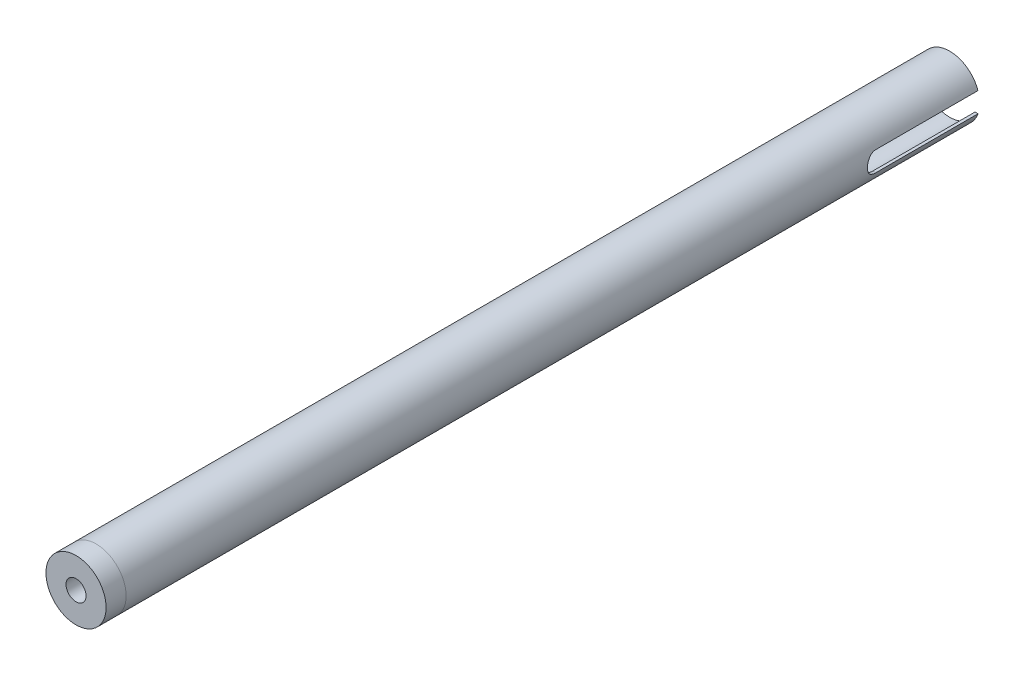
ISO-10303-21;
HEADER;
FILE_DESCRIPTION(('STEP AP214'),'2;1');
FILE_NAME('part.step','',(''),(''),'','','');
FILE_SCHEMA(('AUTOMOTIVE_DESIGN { 1 0 10303 214 1 1 1 1 }'));
ENDSEC;
DATA;
#1=APPLICATION_CONTEXT('core data for automotive mechanical design processes');
#2=APPLICATION_PROTOCOL_DEFINITION('international standard','automotive_design',2000,#1);
#3=PRODUCT_CONTEXT('',#1,'mechanical');
#4=PRODUCT('Part','Part','',(#3));
#5=PRODUCT_RELATED_PRODUCT_CATEGORY('part','',(#4));
#6=PRODUCT_DEFINITION_FORMATION('','',#4);
#7=PRODUCT_DEFINITION_CONTEXT('part definition',#1,'design');
#8=PRODUCT_DEFINITION('design','',#6,#7);
#9=PRODUCT_DEFINITION_SHAPE('','',#8);
#10=(LENGTH_UNIT() NAMED_UNIT(*) SI_UNIT(.MILLI.,.METRE.));
#11=(NAMED_UNIT(*) PLANE_ANGLE_UNIT() SI_UNIT($,.RADIAN.));
#12=(NAMED_UNIT(*) SI_UNIT($,.STERADIAN.) SOLID_ANGLE_UNIT());
#13=UNCERTAINTY_MEASURE_WITH_UNIT(LENGTH_MEASURE(1.E-05),#10,'distance_accuracy_value','');
#14=(GEOMETRIC_REPRESENTATION_CONTEXT(3) GLOBAL_UNCERTAINTY_ASSIGNED_CONTEXT((#13)) GLOBAL_UNIT_ASSIGNED_CONTEXT((#10,
#11,#12)) REPRESENTATION_CONTEXT('',''));
#15=CARTESIAN_POINT('',(0.,0.,0.));
#16=DIRECTION('',(0.,0.,1.));
#17=DIRECTION('',(1.,0.,0.));
#18=AXIS2_PLACEMENT_3D('',#15,#16,#17);
#19=CARTESIAN_POINT('',(0.,0.,-276.704034137088));
#20=DIRECTION('',(0.,0.,1.));
#21=DIRECTION('',(1.,0.,0.));
#22=AXIS2_PLACEMENT_3D('',#19,#20,#21);
#23=CYLINDRICAL_SURFACE('',#22,9.525);
#24=CARTESIAN_POINT('',(0.,0.,-6.35));
#25=DIRECTION('',(0.,0.,1.));
#26=DIRECTION('',(1.,0.,0.));
#27=AXIS2_PLACEMENT_3D('',#24,#25,#26);
#28=CIRCLE('',#27,9.525);
#29=CARTESIAN_POINT('',(9.525,0.,-6.35));
#30=VERTEX_POINT('',#29);
#31=EDGE_CURVE('E165',#30,#30,#28,.T.);
#32=ORIENTED_EDGE('',*,*,#31,.F.);
#33=EDGE_LOOP('',(#32));
#34=FACE_BOUND('',#33,.T.);
#35=CARTESIAN_POINT('',(-8.98025612106915,3.175,-244.319034137088));
#36=CARTESIAN_POINT('',(-8.98024230233901,3.17501142134308,-244.232408033752));
#37=CARTESIAN_POINT('',(-8.98150922759707,3.17145501317748,-244.145789651276));
#38=CARTESIAN_POINT('',(-8.98650170400112,3.1572955094353,-243.973224836451));
#39=CARTESIAN_POINT('',(-8.99022659113085,3.14669431699565,-243.887278228965));
#40=CARTESIAN_POINT('',(-9.00001740508998,3.11857670914846,-243.7169239878));
#41=CARTESIAN_POINT('',(-9.00607621805003,3.10108130380329,-243.632512485993));
#42=CARTESIAN_POINT('',(-9.02033586435303,3.05935434973545,-243.465577684657));
#43=CARTESIAN_POINT('',(-9.02853677497232,3.03512255799513,-243.383054453366));
#44=CARTESIAN_POINT('',(-9.05598792154067,2.95264369348964,-243.139255830089));
#45=CARTESIAN_POINT('',(-9.07810200713862,2.88457148458964,-242.981502245765));
#46=CARTESIAN_POINT('',(-9.127451360236,2.72437908867647,-242.679625727276));
#47=CARTESIAN_POINT('',(-9.15468995097455,2.63224328129309,-242.535511730048));
#48=CARTESIAN_POINT('',(-9.21240416673121,2.42269155952414,-242.259358870223));
#49=CARTESIAN_POINT('',(-9.24296008478943,2.30449853156512,-242.127925288361));
#50=CARTESIAN_POINT('',(-9.30318902123143,2.04784031127145,-241.886329992024));
#51=CARTESIAN_POINT('',(-9.33286185998227,1.90937102786996,-241.776172580792));
#52=CARTESIAN_POINT('',(-9.38892492365178,1.61159672697579,-241.577455569304));
#53=CARTESIAN_POINT('',(-9.41520772598947,1.45183792838569,-241.489543383294));
#54=CARTESIAN_POINT('',(-9.46054712430069,1.11883883316161,-241.342138657224));
#55=CARTESIAN_POINT('',(-9.47961052807859,0.945611424033749,-241.282619329222));
#56=CARTESIAN_POINT('',(-9.50410661247238,0.642992499572345,-241.207140564727));
#57=CARTESIAN_POINT('',(-9.51189798251809,0.515662964135989,-241.183522592684));
#58=CARTESIAN_POINT('',(-9.51973491912187,0.323120458247677,-241.15985632651));
#59=CARTESIAN_POINT('',(-9.52170555244691,0.258670486244967,-241.153927678894));
#60=CARTESIAN_POINT('',(-9.52433958502699,0.129484930346638,-241.146015054227));
#61=CARTESIAN_POINT('',(-9.5250026318504,0.0647492741617516,-241.144032140662));
#62=CARTESIAN_POINT('',(-9.525,0.,-241.144034137088));
#63=B_SPLINE_CURVE_WITH_KNOTS('',3,(#35,#36,#37,#38,#39,#40,#41,#42,#43,#44,#45,#46,#47,#48,#49,
#50,#51,#52,#53,#54,#55,#56,#57,#58,#59,#60,#61,#62),.UNSPECIFIED.,.F.,.F.,(4,2,2,2,2,2,2,2,2,2,
2,2,2,4),(0.,0.259783027985017,0.519495904525387,0.778423354079382,1.0373601457496,
1.55448370709136,2.07194378605916,2.60765740005747,3.14347925237351,3.69345572792677,
4.24291228331232,4.63105001394517,4.8251849841295,5.01937227204627),.UNSPECIFIED.);
#64=CARTESIAN_POINT('',(-8.98025612106915,3.175,-244.319034137088));
#65=VERTEX_POINT('',#64);
#66=CARTESIAN_POINT('',(-9.525,0.,-241.144034137088));
#67=VERTEX_POINT('',#66);
#68=EDGE_CURVE('E192',#65,#67,#63,.T.);
#69=ORIENTED_EDGE('',*,*,#68,.T.);
#70=CARTESIAN_POINT('',(-9.525,0.,-241.144034137088));
#71=CARTESIAN_POINT('',(-9.52501110102584,-0.0867614879611003,-241.144023032051));
#72=CARTESIAN_POINT('',(-9.52381482114642,-0.173516026970682,-241.147590243708));
#73=CARTESIAN_POINT('',(-9.51909010104991,-0.346361025979099,-241.16179508229));
#74=CARTESIAN_POINT('',(-9.51556219632442,-0.432451633867615,-241.172431085767));
#75=CARTESIAN_POINT('',(-9.50626969526085,-0.603121388983422,-241.200648077281));
#76=CARTESIAN_POINT('',(-9.50051134567603,-0.687704073408633,-241.21820967145));
#77=CARTESIAN_POINT('',(-9.48692170416637,-0.854983898510568,-241.260100992087));
#78=CARTESIAN_POINT('',(-9.47909035815865,-0.937680989932476,-241.284430895137));
#79=CARTESIAN_POINT('',(-9.45278540829331,-1.18202731628103,-241.367265288075));
#80=CARTESIAN_POINT('',(-9.43148823554423,-1.3401498669332,-241.435650969421));
#81=CARTESIAN_POINT('',(-9.38354405256208,-1.64264414222568,-241.596577495197));
#82=CARTESIAN_POINT('',(-9.35689419571071,-1.78700848960573,-241.689131200351));
#83=CARTESIAN_POINT('',(-9.30002401422067,-2.06291632995429,-241.899124628556));
#84=CARTESIAN_POINT('',(-9.26971861159363,-2.19392359690275,-242.017246913975));
#85=CARTESIAN_POINT('',(-9.20941732427212,-2.43468689521898,-242.27358489081));
#86=CARTESIAN_POINT('',(-9.1794215361322,-2.54443647619592,-242.411806658968));
#87=CARTESIAN_POINT('',(-9.122187697517,-2.74268087840455,-242.709314638016));
#88=CARTESIAN_POINT('',(-9.09505529775998,-2.83046425019683,-242.869096776089));
#89=CARTESIAN_POINT('',(-9.04794936227173,-2.97762337182932,-243.202141098094));
#90=CARTESIAN_POINT('',(-9.0279682579705,-3.03702917747986,-243.375388792902));
#91=CARTESIAN_POINT('',(-9.00226999890487,-3.11221256504251,-243.677675826897));
#92=CARTESIAN_POINT('',(-8.99408207355733,-3.13569679171672,-243.804638148324));
#93=CARTESIAN_POINT('',(-8.98304472933549,-3.16711304593222,-244.060715320093));
#94=CARTESIAN_POINT('',(-8.98019613476149,-3.17504267212105,-244.189830499695));
#95=CARTESIAN_POINT('',(-8.98025612106915,-3.175,-244.319034137088));
#96=B_SPLINE_CURVE_WITH_KNOTS('',3,(#70,#71,#72,#73,#74,#75,#76,#77,#78,#79,#80,#81,#82,#83,#84,
#85,#86,#87,#88,#89,#90,#91,#92,#93,#94,#95),.UNSPECIFIED.,.F.,.F.,(4,2,2,2,2,2,2,2,2,2,2,2,4),
(0.,0.260191091827301,0.520322447737218,0.779730467212509,1.03914525511039,1.55731822615722,
2.07576750062864,2.61028978360819,3.14497400776477,3.69521752133767,4.24487695078963,
4.63199348452993,5.01916977744545),.UNSPECIFIED.);
#97=CARTESIAN_POINT('',(-8.98025612106916,-3.175,-244.319034137088));
#98=VERTEX_POINT('',#97);
#99=EDGE_CURVE('E144',#67,#98,#96,.T.);
#100=ORIENTED_EDGE('',*,*,#99,.T.);
#101=DIRECTION('',(0.,0.,-1.));
#102=VECTOR('',#101,1.);
#103=CARTESIAN_POINT('',(-8.98025612106916,-3.175,-241.144034137088));
#104=LINE('',#103,#102);
#105=CARTESIAN_POINT('',(-8.98025612106916,-3.175,-276.704034137088));
#106=VERTEX_POINT('',#105);
#107=EDGE_CURVE('E139',#98,#106,#104,.T.);
#108=ORIENTED_EDGE('',*,*,#107,.T.);
#109=CARTESIAN_POINT('',(0.,0.,-276.704034137088));
#110=DIRECTION('',(0.,0.,1.));
#111=DIRECTION('',(1.,0.,0.));
#112=AXIS2_PLACEMENT_3D('',#109,#110,#111);
#113=CIRCLE('',#112,9.525);
#114=CARTESIAN_POINT('',(8.98025612106915,-3.175,-276.704034137088));
#115=VERTEX_POINT('',#114);
#116=EDGE_CURVE('E142',#106,#115,#113,.T.);
#117=ORIENTED_EDGE('',*,*,#116,.T.);
#118=DIRECTION('',(0.,0.,-1.));
#119=VECTOR('',#118,1.);
#120=CARTESIAN_POINT('',(8.98025612106915,-3.175,-241.144034137088));
#121=LINE('',#120,#119);
#122=CARTESIAN_POINT('',(8.98025612106915,-3.175,-244.319034137088));
#123=VERTEX_POINT('',#122);
#124=EDGE_CURVE('E425',#123,#115,#121,.T.);
#125=ORIENTED_EDGE('',*,*,#124,.F.);
#126=CARTESIAN_POINT('',(8.98025612106915,-3.175,-244.319034137088));
#127=CARTESIAN_POINT('',(8.98024230233901,-3.17501142134308,-244.232408033752));
#128=CARTESIAN_POINT('',(8.98150922759707,-3.17145501317748,-244.145789651276));
#129=CARTESIAN_POINT('',(8.98650170400112,-3.1572955094353,-243.973224836451));
#130=CARTESIAN_POINT('',(8.99022659113085,-3.14669431699565,-243.887278228965));
#131=CARTESIAN_POINT('',(9.00001740508998,-3.11857670914846,-243.7169239878));
#132=CARTESIAN_POINT('',(9.00607621805003,-3.10108130380329,-243.632512485993));
#133=CARTESIAN_POINT('',(9.02033586435303,-3.05935434973545,-243.465577684657));
#134=CARTESIAN_POINT('',(9.02853677497232,-3.03512255799513,-243.383054453366));
#135=CARTESIAN_POINT('',(9.05598792154067,-2.95264369348964,-243.139255830089));
#136=CARTESIAN_POINT('',(9.07810200713862,-2.88457148458964,-242.981502245765));
#137=CARTESIAN_POINT('',(9.127451360236,-2.72437908867647,-242.679625727276));
#138=CARTESIAN_POINT('',(9.15468995097455,-2.63224328129309,-242.535511730048));
#139=CARTESIAN_POINT('',(9.21240416673121,-2.42269155952414,-242.259358870223));
#140=CARTESIAN_POINT('',(9.24296008478943,-2.30449853156512,-242.127925288361));
#141=CARTESIAN_POINT('',(9.30318902123143,-2.04784031127145,-241.886329992024));
#142=CARTESIAN_POINT('',(9.33286185998227,-1.90937102786996,-241.776172580792));
#143=CARTESIAN_POINT('',(9.38892492365178,-1.61159672697579,-241.577455569304));
#144=CARTESIAN_POINT('',(9.41520772598947,-1.45183792838569,-241.489543383294));
#145=CARTESIAN_POINT('',(9.46054712430069,-1.11883883316161,-241.342138657224));
#146=CARTESIAN_POINT('',(9.47961052807859,-0.945611424033749,-241.282619329222));
#147=CARTESIAN_POINT('',(9.50410661247238,-0.642992499572345,-241.207140564727));
#148=CARTESIAN_POINT('',(9.51189798251809,-0.515662964135989,-241.183522592684));
#149=CARTESIAN_POINT('',(9.51973491912187,-0.323120458247677,-241.15985632651));
#150=CARTESIAN_POINT('',(9.52170555244691,-0.258670486244967,-241.153927678894));
#151=CARTESIAN_POINT('',(9.52433958502699,-0.129484930346638,-241.146015054227));
#152=CARTESIAN_POINT('',(9.5250026318504,-0.0647492741617516,-241.144032140662));
#153=CARTESIAN_POINT('',(9.525,0.,-241.144034137088));
#154=B_SPLINE_CURVE_WITH_KNOTS('',3,(#126,#127,#128,#129,#130,#131,#132,#133,#134,#135,#136,
#137,#138,#139,#140,#141,#142,#143,#144,#145,#146,#147,#148,#149,#150,#151,#152,#153),
.UNSPECIFIED.,.F.,.F.,(4,2,2,2,2,2,2,2,2,2,2,2,2,4),(0.,0.259783027985017,0.519495904525387,
0.778423354079382,1.0373601457496,1.55448370709136,2.07194378605916,2.60765740005747,
3.14347925237351,3.69345572792677,4.24291228331232,4.63105001394517,4.8251849841295,
5.01937227204627),.UNSPECIFIED.);
#155=CARTESIAN_POINT('',(9.525,0.,-241.144034137088));
#156=VERTEX_POINT('',#155);
#157=EDGE_CURVE('E85',#123,#156,#154,.T.);
#158=ORIENTED_EDGE('',*,*,#157,.T.);
#159=CARTESIAN_POINT('',(9.525,0.,-241.144034137088));
#160=CARTESIAN_POINT('',(9.52501110102584,0.0867614879611003,-241.144023032051));
#161=CARTESIAN_POINT('',(9.52381482114642,0.173516026970682,-241.147590243708));
#162=CARTESIAN_POINT('',(9.51909010104991,0.346361025979099,-241.16179508229));
#163=CARTESIAN_POINT('',(9.51556219632442,0.432451633867615,-241.172431085767));
#164=CARTESIAN_POINT('',(9.50626969526085,0.603121388983422,-241.200648077281));
#165=CARTESIAN_POINT('',(9.50051134567603,0.687704073408633,-241.21820967145));
#166=CARTESIAN_POINT('',(9.48692170416637,0.854983898510568,-241.260100992087));
#167=CARTESIAN_POINT('',(9.47909035815865,0.937680989932476,-241.284430895137));
#168=CARTESIAN_POINT('',(9.45278540829331,1.18202731628103,-241.367265288075));
#169=CARTESIAN_POINT('',(9.43148823554423,1.3401498669332,-241.435650969421));
#170=CARTESIAN_POINT('',(9.38354405256208,1.64264414222568,-241.596577495197));
#171=CARTESIAN_POINT('',(9.35689419571071,1.78700848960573,-241.689131200351));
#172=CARTESIAN_POINT('',(9.30002401422067,2.06291632995429,-241.899124628556));
#173=CARTESIAN_POINT('',(9.26971861159363,2.19392359690275,-242.017246913975));
#174=CARTESIAN_POINT('',(9.20941732427212,2.43468689521898,-242.27358489081));
#175=CARTESIAN_POINT('',(9.1794215361322,2.54443647619592,-242.411806658968));
#176=CARTESIAN_POINT('',(9.122187697517,2.74268087840455,-242.709314638016));
#177=CARTESIAN_POINT('',(9.09505529775998,2.83046425019683,-242.869096776089));
#178=CARTESIAN_POINT('',(9.04794936227173,2.97762337182932,-243.202141098094));
#179=CARTESIAN_POINT('',(9.0279682579705,3.03702917747986,-243.375388792902));
#180=CARTESIAN_POINT('',(9.00226999890487,3.11221256504251,-243.677675826897));
#181=CARTESIAN_POINT('',(8.99408207355733,3.13569679171672,-243.804638148324));
#182=CARTESIAN_POINT('',(8.98304472933549,3.16711304593222,-244.060715320093));
#183=CARTESIAN_POINT('',(8.98019613476149,3.17504267212105,-244.189830499695));
#184=CARTESIAN_POINT('',(8.98025612106915,3.175,-244.319034137088));
#185=B_SPLINE_CURVE_WITH_KNOTS('',3,(#159,#160,#161,#162,#163,#164,#165,#166,#167,#168,#169,
#170,#171,#172,#173,#174,#175,#176,#177,#178,#179,#180,#181,#182,#183,#184),.UNSPECIFIED.,.F.,
.F.,(4,2,2,2,2,2,2,2,2,2,2,2,4),(0.,0.260191091827301,0.520322447737218,0.779730467212509,
1.03914525511039,1.55731822615722,2.07576750062864,2.61028978360819,3.14497400776477,
3.69521752133767,4.24487695078963,4.63199348452993,5.01916977744545),.UNSPECIFIED.);
#186=CARTESIAN_POINT('',(8.98025612106915,3.175,-244.319034137088));
#187=VERTEX_POINT('',#186);
#188=EDGE_CURVE('E71',#156,#187,#185,.T.);
#189=ORIENTED_EDGE('',*,*,#188,.T.);
#190=DIRECTION('',(0.,0.,-1.));
#191=VECTOR('',#190,1.);
#192=CARTESIAN_POINT('',(8.98025612106915,3.175,-241.144034137088));
#193=LINE('',#192,#191);
#194=CARTESIAN_POINT('',(8.98025612106915,3.175,-276.704034137088));
#195=VERTEX_POINT('',#194);
#196=EDGE_CURVE('E158',#187,#195,#193,.T.);
#197=ORIENTED_EDGE('',*,*,#196,.T.);
#198=CARTESIAN_POINT('',(-8.98025612106915,3.175,-276.704034137088));
#199=VERTEX_POINT('',#198);
#200=EDGE_CURVE('E164',#195,#199,#113,.T.);
#201=ORIENTED_EDGE('',*,*,#200,.T.);
#202=DIRECTION('',(0.,0.,-1.));
#203=VECTOR('',#202,1.);
#204=CARTESIAN_POINT('',(-8.98025612106915,3.175,-241.144034137088));
#205=LINE('',#204,#203);
#206=EDGE_CURVE('E418',#65,#199,#205,.T.);
#207=ORIENTED_EDGE('',*,*,#206,.F.);
#208=EDGE_LOOP('',(#69,#100,#108,#117,#125,#158,#189,#197,#201,#207));
#209=FACE_BOUND('',#208,.T.);
#210=ADVANCED_FACE('F61',(#34,#209),#23,.T.);
#211=CARTESIAN_POINT('',(0.,0.,-276.704034137088));
#212=DIRECTION('',(0.,0.,1.));
#213=DIRECTION('',(1.,0.,0.));
#214=AXIS2_PLACEMENT_3D('',#211,#212,#213);
#215=PLANE('',#214);
#216=DIRECTION('',(1.,0.,0.));
#217=VECTOR('',#216,1.);
#218=CARTESIAN_POINT('',(0.,-3.175,-276.704034137088));
#219=LINE('',#218,#217);
#220=CARTESIAN_POINT('',(-8.03118117091129,-3.175,-276.704034137088));
#221=VERTEX_POINT('',#220);
#222=EDGE_CURVE('E151',#106,#221,#219,.T.);
#223=ORIENTED_EDGE('',*,*,#222,.T.);
#224=CARTESIAN_POINT('',(0.,0.,-276.704034137088));
#225=DIRECTION('',(0.,0.,1.));
#226=DIRECTION('',(1.,0.,0.));
#227=AXIS2_PLACEMENT_3D('',#224,#225,#226);
#228=CIRCLE('',#227,8.636);
#229=CARTESIAN_POINT('',(8.03118117091129,-3.175,-276.704034137088));
#230=VERTEX_POINT('',#229);
#231=EDGE_CURVE('E273',#221,#230,#228,.T.);
#232=ORIENTED_EDGE('',*,*,#231,.T.);
#233=DIRECTION('',(1.,0.,0.));
#234=VECTOR('',#233,1.);
#235=CARTESIAN_POINT('',(0.,-3.175,-276.704034137088));
#236=LINE('',#235,#234);
#237=EDGE_CURVE('E163',#230,#115,#236,.T.);
#238=ORIENTED_EDGE('',*,*,#237,.T.);
#239=ORIENTED_EDGE('',*,*,#116,.F.);
#240=EDGE_LOOP('',(#223,#232,#238,#239));
#241=FACE_BOUND('',#240,.T.);
#242=ADVANCED_FACE('F161',(#241),#215,.F.);
#243=CARTESIAN_POINT('',(0.,0.,-276.704034137088));
#244=DIRECTION('',(0.,0.,1.));
#245=DIRECTION('',(1.,0.,0.));
#246=AXIS2_PLACEMENT_3D('',#243,#244,#245);
#247=CYLINDRICAL_SURFACE('',#246,8.636);
#248=CARTESIAN_POINT('',(0.,0.,-6.35));
#249=DIRECTION('',(0.,0.,1.));
#250=DIRECTION('',(1.,0.,0.));
#251=AXIS2_PLACEMENT_3D('',#248,#249,#250);
#252=CIRCLE('',#251,8.636);
#253=CARTESIAN_POINT('',(8.636,0.,-6.35));
#254=VERTEX_POINT('',#253);
#255=EDGE_CURVE('E147',#254,#254,#252,.T.);
#256=ORIENTED_EDGE('',*,*,#255,.T.);
#257=EDGE_LOOP('',(#256));
#258=FACE_BOUND('',#257,.T.);
#259=DIRECTION('',(0.,0.,-1.));
#260=VECTOR('',#259,1.);
#261=CARTESIAN_POINT('',(-8.03118117091129,-3.175,-241.144034137088));
#262=LINE('',#261,#260);
#263=CARTESIAN_POINT('',(-8.03118117091129,-3.175,-244.319034137088));
#264=VERTEX_POINT('',#263);
#265=EDGE_CURVE('E148',#264,#221,#262,.T.);
#266=ORIENTED_EDGE('',*,*,#265,.F.);
#267=CARTESIAN_POINT('',(-8.03118117091129,-3.175,-244.319034137088));
#268=CARTESIAN_POINT('',(-8.03116550357192,-3.17501203663229,-244.232999168972));
#269=CARTESIAN_POINT('',(-8.03256328665433,-3.17150327993898,-244.146972816443));
#270=CARTESIAN_POINT('',(-8.03806891362409,-3.15753809299539,-243.975600245974));
#271=CARTESIAN_POINT('',(-8.04217588089715,-3.147083910078,-243.890253817068));
#272=CARTESIAN_POINT('',(-8.05296421917626,-3.11937037021479,-243.721144682852));
#273=CARTESIAN_POINT('',(-8.05963650808002,-3.10213501593151,-243.63737747191));
#274=CARTESIAN_POINT('',(-8.07533202922414,-3.06104389654163,-243.471728509142));
#275=CARTESIAN_POINT('',(-8.08435537430867,-3.03718781365489,-243.389846848023));
#276=CARTESIAN_POINT('',(-8.11453837074661,-2.95603278100126,-243.147994690778));
#277=CARTESIAN_POINT('',(-8.13883087950845,-2.88909903597751,-242.991528053203));
#278=CARTESIAN_POINT('',(-8.19300406693487,-2.7316794881875,-242.691993064078));
#279=CARTESIAN_POINT('',(-8.2228893144862,-2.64117440539559,-242.548935811521));
#280=CARTESIAN_POINT('',(-8.28646461334555,-2.43457537576573,-242.273465402283));
#281=CARTESIAN_POINT('',(-8.32026315150129,-2.31754645569598,-242.141777030196));
#282=CARTESIAN_POINT('',(-8.38695072719909,-2.06320558041452,-241.899388851802));
#283=CARTESIAN_POINT('',(-8.41983956911545,-1.92588930215217,-241.788693530432));
#284=CARTESIAN_POINT('',(-8.48230406273647,-1.62932475427475,-241.587912415482));
#285=CARTESIAN_POINT('',(-8.51173519592471,-1.46950375402868,-241.498624061976));
#286=CARTESIAN_POINT('',(-8.56262575627031,-1.13591027783605,-241.348561909013));
#287=CARTESIAN_POINT('',(-8.58409342507971,-0.962152453429188,-241.287758612193));
#288=CARTESIAN_POINT('',(-8.61197450421745,-0.656412542712551,-241.209834246543));
#289=CARTESIAN_POINT('',(-8.62092967235125,-0.52653821034923,-241.185218462205));
#290=CARTESIAN_POINT('',(-8.62994176115801,-0.33002097693849,-241.160541130489));
#291=CARTESIAN_POINT('',(-8.63220903333297,-0.264206342476339,-241.154356391339));
#292=CARTESIAN_POINT('',(-8.63523992352765,-0.132266265743968,-241.146101175893));
#293=CARTESIAN_POINT('',(-8.6360031097792,-0.0661407396870625,-241.14403188099));
#294=CARTESIAN_POINT('',(-8.636,0.,-241.144034137088));
#295=B_SPLINE_CURVE_WITH_KNOTS('',3,(#267,#268,#269,#270,#271,#272,#273,#274,#275,#276,#277,
#278,#279,#280,#281,#282,#283,#284,#285,#286,#287,#288,#289,#290,#291,#292,#293,#294),
.UNSPECIFIED.,.F.,.F.,(4,2,2,2,2,2,2,2,2,2,2,2,2,4),(0.,0.258007583993629,0.515931725057033,
0.772951013405609,1.02998264023841,1.54317615093285,2.05679075055087,2.59254838663383,
3.12842035287703,3.68191422398172,4.23483365719867,4.63113823379686,4.8294369210689,
5.02779252437178),.UNSPECIFIED.);
#296=CARTESIAN_POINT('',(-8.636,0.,-241.144034137088));
#297=VERTEX_POINT('',#296);
#298=EDGE_CURVE('E219',#264,#297,#295,.T.);
#299=ORIENTED_EDGE('',*,*,#298,.T.);
#300=CARTESIAN_POINT('',(-8.636,0.,-241.144034137088));
#301=CARTESIAN_POINT('',(-8.63601200177566,0.086234054502865,-241.144022563365));
#302=CARTESIAN_POINT('',(-8.63470866649585,0.172460638964014,-241.147547103385));
#303=CARTESIAN_POINT('',(-8.62956076290727,0.34424536862396,-241.161578533015));
#304=CARTESIAN_POINT('',(-8.62571686385256,0.429803683858972,-241.172083583771));
#305=CARTESIAN_POINT('',(-8.61559314175803,0.599377201936824,-241.199942337826));
#306=CARTESIAN_POINT('',(-8.60932102288695,0.683396413719316,-241.217274383682));
#307=CARTESIAN_POINT('',(-8.5945171663722,0.84955353944947,-241.258605606958));
#308=CARTESIAN_POINT('',(-8.58598535382315,0.931691390934835,-241.282605005391));
#309=CARTESIAN_POINT('',(-8.55732464851214,1.17435074221828,-241.364279186829));
#310=CARTESIAN_POINT('',(-8.53411500636261,1.33136171263577,-241.431670507795));
#311=CARTESIAN_POINT('',(-8.48180653117632,1.63181198358794,-241.590162217805));
#312=CARTESIAN_POINT('',(-8.45270389942466,1.77524244193608,-241.681277910842));
#313=CARTESIAN_POINT('',(-8.39029834803106,2.05036661398533,-241.88853102852));
#314=CARTESIAN_POINT('',(-8.35688032192871,2.18143474113562,-242.005465396112));
#315=CARTESIAN_POINT('',(-8.29018507770489,2.42260670191497,-242.259354382569));
#316=CARTESIAN_POINT('',(-8.25690791509208,2.53270290926751,-242.396316252399));
#317=CARTESIAN_POINT('',(-8.19291826363247,2.73277128594143,-242.692481341224));
#318=CARTESIAN_POINT('',(-8.16234475412033,2.82185641770733,-242.852316430661));
#319=CARTESIAN_POINT('',(-8.10906121054024,2.97153048258985,-243.185911774163));
#320=CARTESIAN_POINT('',(-8.08634169503735,3.03215380703845,-243.359654923832));
#321=CARTESIAN_POINT('',(-8.05677760160867,3.10966172606007,-243.664923558645));
#322=CARTESIAN_POINT('',(-8.04725077861386,3.13409804308656,-243.794304277851));
#323=CARTESIAN_POINT('',(-8.03764862425496,3.15860280233702,-243.990111403691));
#324=CARTESIAN_POINT('',(-8.0352292163598,3.16474613160122,-244.055704159997));
#325=CARTESIAN_POINT('',(-8.03199317651195,3.17294655384153,-244.187204112387));
#326=CARTESIAN_POINT('',(-8.03117703985816,3.17500238406813,-244.253111399337));
#327=CARTESIAN_POINT('',(-8.03118117091129,3.175,-244.319034137088));
#328=B_SPLINE_CURVE_WITH_KNOTS('',3,(#300,#301,#302,#303,#304,#305,#306,#307,#308,#309,#310,
#311,#312,#313,#314,#315,#316,#317,#318,#319,#320,#321,#322,#323,#324,#325,#326,#327),
.UNSPECIFIED.,.F.,.F.,(4,2,2,2,2,2,2,2,2,2,2,2,2,4),(0.,0.258607684277236,0.517147271349145,
0.774873208333403,1.0326076896076,1.54734347080468,2.06241212125686,2.59642224394463,
3.13062618611959,3.68443916069367,4.237581211598,4.63245186558866,4.83009172977029,
5.02779264127874),.UNSPECIFIED.);
#329=CARTESIAN_POINT('',(-8.03118117091129,3.175,-244.319034137088));
#330=VERTEX_POINT('',#329);
#331=EDGE_CURVE('E184',#297,#330,#328,.T.);
#332=ORIENTED_EDGE('',*,*,#331,.T.);
#333=DIRECTION('',(0.,0.,-1.));
#334=VECTOR('',#333,1.);
#335=CARTESIAN_POINT('',(-8.03118117091129,3.175,-241.144034137088));
#336=LINE('',#335,#334);
#337=CARTESIAN_POINT('',(-8.03118117091129,3.175,-276.704034137088));
#338=VERTEX_POINT('',#337);
#339=EDGE_CURVE('E415',#330,#338,#336,.T.);
#340=ORIENTED_EDGE('',*,*,#339,.T.);
#341=CARTESIAN_POINT('',(8.03118117091129,3.175,-276.704034137088));
#342=VERTEX_POINT('',#341);
#343=EDGE_CURVE('E170',#342,#338,#228,.T.);
#344=ORIENTED_EDGE('',*,*,#343,.F.);
#345=DIRECTION('',(0.,0.,-1.));
#346=VECTOR('',#345,1.);
#347=CARTESIAN_POINT('',(8.03118117091129,3.175,-241.144034137088));
#348=LINE('',#347,#346);
#349=CARTESIAN_POINT('',(8.03118117091129,3.175,-244.319034137088));
#350=VERTEX_POINT('',#349);
#351=EDGE_CURVE('E267',#350,#342,#348,.T.);
#352=ORIENTED_EDGE('',*,*,#351,.F.);
#353=CARTESIAN_POINT('',(8.03118117091129,3.175,-244.319034137088));
#354=CARTESIAN_POINT('',(8.03116550357192,3.17501203663229,-244.232999168972));
#355=CARTESIAN_POINT('',(8.03256328665433,3.17150327993898,-244.146972816443));
#356=CARTESIAN_POINT('',(8.03806891362409,3.15753809299539,-243.975600245974));
#357=CARTESIAN_POINT('',(8.04217588089715,3.147083910078,-243.890253817068));
#358=CARTESIAN_POINT('',(8.05296421917626,3.11937037021479,-243.721144682852));
#359=CARTESIAN_POINT('',(8.05963650808002,3.10213501593151,-243.63737747191));
#360=CARTESIAN_POINT('',(8.07533202922414,3.06104389654163,-243.471728509142));
#361=CARTESIAN_POINT('',(8.08435537430867,3.03718781365489,-243.389846848023));
#362=CARTESIAN_POINT('',(8.11453837074661,2.95603278100126,-243.147994690778));
#363=CARTESIAN_POINT('',(8.13883087950845,2.88909903597751,-242.991528053203));
#364=CARTESIAN_POINT('',(8.19300406693487,2.7316794881875,-242.691993064078));
#365=CARTESIAN_POINT('',(8.2228893144862,2.64117440539559,-242.548935811521));
#366=CARTESIAN_POINT('',(8.28646461334555,2.43457537576573,-242.273465402283));
#367=CARTESIAN_POINT('',(8.32026315150129,2.31754645569598,-242.141777030196));
#368=CARTESIAN_POINT('',(8.38695072719909,2.06320558041452,-241.899388851802));
#369=CARTESIAN_POINT('',(8.41983956911545,1.92588930215217,-241.788693530432));
#370=CARTESIAN_POINT('',(8.48230406273647,1.62932475427475,-241.587912415482));
#371=CARTESIAN_POINT('',(8.51173519592471,1.46950375402868,-241.498624061976));
#372=CARTESIAN_POINT('',(8.56262575627031,1.13591027783605,-241.348561909013));
#373=CARTESIAN_POINT('',(8.58409342507971,0.962152453429188,-241.287758612193));
#374=CARTESIAN_POINT('',(8.61197450421745,0.656412542712551,-241.209834246543));
#375=CARTESIAN_POINT('',(8.62092967235125,0.52653821034923,-241.185218462205));
#376=CARTESIAN_POINT('',(8.62994176115801,0.33002097693849,-241.160541130489));
#377=CARTESIAN_POINT('',(8.63220903333297,0.264206342476339,-241.154356391339));
#378=CARTESIAN_POINT('',(8.63523992352765,0.132266265743968,-241.146101175893));
#379=CARTESIAN_POINT('',(8.6360031097792,0.0661407396870625,-241.14403188099));
#380=CARTESIAN_POINT('',(8.636,0.,-241.144034137088));
#381=B_SPLINE_CURVE_WITH_KNOTS('',3,(#353,#354,#355,#356,#357,#358,#359,#360,#361,#362,#363,
#364,#365,#366,#367,#368,#369,#370,#371,#372,#373,#374,#375,#376,#377,#378,#379,#380),
.UNSPECIFIED.,.F.,.F.,(4,2,2,2,2,2,2,2,2,2,2,2,2,4),(0.,0.258007583993629,0.515931725057033,
0.772951013405609,1.02998264023841,1.54317615093285,2.05679075055087,2.59254838663383,
3.12842035287703,3.68191422398172,4.23483365719867,4.63113823379686,4.8294369210689,
5.02779252437178),.UNSPECIFIED.);
#382=CARTESIAN_POINT('',(8.636,0.,-241.144034137088));
#383=VERTEX_POINT('',#382);
#384=EDGE_CURVE('E13',#350,#383,#381,.T.);
#385=ORIENTED_EDGE('',*,*,#384,.T.);
#386=CARTESIAN_POINT('',(8.636,0.,-241.144034137088));
#387=CARTESIAN_POINT('',(8.63601200177566,-0.086234054502865,-241.144022563365));
#388=CARTESIAN_POINT('',(8.63470866649585,-0.172460638964014,-241.147547103385));
#389=CARTESIAN_POINT('',(8.62956076290727,-0.34424536862396,-241.161578533015));
#390=CARTESIAN_POINT('',(8.62571686385256,-0.429803683858972,-241.172083583771));
#391=CARTESIAN_POINT('',(8.61559314175803,-0.599377201936824,-241.199942337826));
#392=CARTESIAN_POINT('',(8.60932102288695,-0.683396413719316,-241.217274383682));
#393=CARTESIAN_POINT('',(8.5945171663722,-0.84955353944947,-241.258605606958));
#394=CARTESIAN_POINT('',(8.58598535382315,-0.931691390934835,-241.282605005391));
#395=CARTESIAN_POINT('',(8.55732464851214,-1.17435074221828,-241.364279186829));
#396=CARTESIAN_POINT('',(8.53411500636261,-1.33136171263577,-241.431670507795));
#397=CARTESIAN_POINT('',(8.48180653117632,-1.63181198358794,-241.590162217805));
#398=CARTESIAN_POINT('',(8.45270389942466,-1.77524244193608,-241.681277910842));
#399=CARTESIAN_POINT('',(8.39029834803106,-2.05036661398533,-241.88853102852));
#400=CARTESIAN_POINT('',(8.35688032192871,-2.18143474113562,-242.005465396112));
#401=CARTESIAN_POINT('',(8.29018507770489,-2.42260670191497,-242.259354382569));
#402=CARTESIAN_POINT('',(8.25690791509208,-2.53270290926751,-242.396316252399));
#403=CARTESIAN_POINT('',(8.19291826363247,-2.73277128594143,-242.692481341224));
#404=CARTESIAN_POINT('',(8.16234475412033,-2.82185641770733,-242.852316430661));
#405=CARTESIAN_POINT('',(8.10906121054024,-2.97153048258985,-243.185911774163));
#406=CARTESIAN_POINT('',(8.08634169503735,-3.03215380703845,-243.359654923832));
#407=CARTESIAN_POINT('',(8.05677760160867,-3.10966172606007,-243.664923558645));
#408=CARTESIAN_POINT('',(8.04725077861386,-3.13409804308656,-243.794304277851));
#409=CARTESIAN_POINT('',(8.03764862425496,-3.15860280233702,-243.990111403691));
#410=CARTESIAN_POINT('',(8.0352292163598,-3.16474613160122,-244.055704159997));
#411=CARTESIAN_POINT('',(8.03199317651195,-3.17294655384153,-244.187204112387));
#412=CARTESIAN_POINT('',(8.03117703985816,-3.17500238406813,-244.253111399337));
#413=CARTESIAN_POINT('',(8.03118117091129,-3.175,-244.319034137088));
#414=B_SPLINE_CURVE_WITH_KNOTS('',3,(#386,#387,#388,#389,#390,#391,#392,#393,#394,#395,#396,
#397,#398,#399,#400,#401,#402,#403,#404,#405,#406,#407,#408,#409,#410,#411,#412,#413),
.UNSPECIFIED.,.F.,.F.,(4,2,2,2,2,2,2,2,2,2,2,2,2,4),(0.,0.258607684277236,0.517147271349145,
0.774873208333403,1.0326076896076,1.54734347080468,2.06241212125686,2.59642224394463,
3.13062618611959,3.68443916069367,4.237581211598,4.63245186558866,4.83009172977029,
5.02779264127874),.UNSPECIFIED.);
#415=CARTESIAN_POINT('',(8.03118117091129,-3.175,-244.319034137088));
#416=VERTEX_POINT('',#415);
#417=EDGE_CURVE('E235',#383,#416,#414,.T.);
#418=ORIENTED_EDGE('',*,*,#417,.T.);
#419=DIRECTION('',(0.,0.,-1.));
#420=VECTOR('',#419,1.);
#421=CARTESIAN_POINT('',(8.03118117091129,-3.175,-241.144034137088));
#422=LINE('',#421,#420);
#423=EDGE_CURVE('E269',#416,#230,#422,.T.);
#424=ORIENTED_EDGE('',*,*,#423,.T.);
#425=ORIENTED_EDGE('',*,*,#231,.F.);
#426=EDGE_LOOP('',(#266,#299,#332,#340,#344,#352,#385,#418,#424,#425));
#427=FACE_BOUND('',#426,.T.);
#428=ADVANCED_FACE('F199',(#258,#427),#247,.F.);
#429=ORIENTED_EDGE('',*,*,#343,.T.);
#430=DIRECTION('',(1.,0.,0.));
#431=VECTOR('',#430,1.);
#432=CARTESIAN_POINT('',(0.,3.175,-276.704034137088));
#433=LINE('',#432,#431);
#434=EDGE_CURVE('E157',#199,#338,#433,.T.);
#435=ORIENTED_EDGE('',*,*,#434,.F.);
#436=ORIENTED_EDGE('',*,*,#200,.F.);
#437=DIRECTION('',(1.,0.,0.));
#438=VECTOR('',#437,1.);
#439=CARTESIAN_POINT('',(0.,3.175,-276.704034137088));
#440=LINE('',#439,#438);
#441=EDGE_CURVE('E251',#342,#195,#440,.T.);
#442=ORIENTED_EDGE('',*,*,#441,.F.);
#443=EDGE_LOOP('',(#429,#435,#436,#442));
#444=FACE_BOUND('',#443,.T.);
#445=ADVANCED_FACE('F284',(#444),#215,.F.);
#446=CARTESIAN_POINT('',(0.,0.,-6.35));
#447=DIRECTION('',(0.,0.,1.));
#448=DIRECTION('',(1.,0.,0.));
#449=AXIS2_PLACEMENT_3D('',#446,#447,#448);
#450=PLANE('',#449);
#451=ORIENTED_EDGE('',*,*,#255,.F.);
#452=EDGE_LOOP('',(#451));
#453=FACE_BOUND('',#452,.T.);
#454=ORIENTED_EDGE('',*,*,#31,.T.);
#455=EDGE_LOOP('',(#454));
#456=FACE_BOUND('',#455,.T.);
#457=ADVANCED_FACE('F281',(#453,#456),#450,.T.);
#458=CARTESIAN_POINT('',(0.,3.175,-241.144034137088));
#459=DIRECTION('',(0.,1.,0.));
#460=DIRECTION('',(0.,0.,1.));
#461=AXIS2_PLACEMENT_3D('',#458,#459,#460);
#462=PLANE('',#461);
#463=ORIENTED_EDGE('',*,*,#196,.F.);
#464=DIRECTION('',(1.,0.,0.));
#465=VECTOR('',#464,1.);
#466=CARTESIAN_POINT('',(8.03118117091129,3.175,-244.319034137088));
#467=LINE('',#466,#465);
#468=EDGE_CURVE('E182',#187,#350,#467,.F.);
#469=ORIENTED_EDGE('',*,*,#468,.T.);
#470=ORIENTED_EDGE('',*,*,#351,.T.);
#471=ORIENTED_EDGE('',*,*,#441,.T.);
#472=EDGE_LOOP('',(#463,#469,#470,#471));
#473=FACE_BOUND('',#472,.T.);
#474=ADVANCED_FACE('F264',(#473),#462,.F.);
#475=CARTESIAN_POINT('',(0.,-3.175,-241.144034137088));
#476=DIRECTION('',(0.,1.,0.));
#477=DIRECTION('',(0.,0.,1.));
#478=AXIS2_PLACEMENT_3D('',#475,#476,#477);
#479=PLANE('',#478);
#480=ORIENTED_EDGE('',*,*,#423,.F.);
#481=DIRECTION('',(1.,0.,0.));
#482=VECTOR('',#481,1.);
#483=CARTESIAN_POINT('',(0.,-3.175,-244.319034137088));
#484=LINE('',#483,#482);
#485=EDGE_CURVE('E179',#416,#123,#484,.T.);
#486=ORIENTED_EDGE('',*,*,#485,.T.);
#487=ORIENTED_EDGE('',*,*,#124,.T.);
#488=ORIENTED_EDGE('',*,*,#237,.F.);
#489=EDGE_LOOP('',(#480,#486,#487,#488));
#490=FACE_BOUND('',#489,.T.);
#491=ADVANCED_FACE('F359',(#490),#479,.T.);
#492=CARTESIAN_POINT('',(0.,-3.175,-241.144034137088));
#493=DIRECTION('',(0.,1.,0.));
#494=DIRECTION('',(0.,0.,1.));
#495=AXIS2_PLACEMENT_3D('',#492,#493,#494);
#496=PLANE('',#495);
#497=ORIENTED_EDGE('',*,*,#107,.F.);
#498=DIRECTION('',(1.,0.,0.));
#499=VECTOR('',#498,1.);
#500=CARTESIAN_POINT('',(0.,-3.175,-244.319034137088));
#501=LINE('',#500,#499);
#502=EDGE_CURVE('E177',#98,#264,#501,.T.);
#503=ORIENTED_EDGE('',*,*,#502,.T.);
#504=ORIENTED_EDGE('',*,*,#265,.T.);
#505=ORIENTED_EDGE('',*,*,#222,.F.);
#506=EDGE_LOOP('',(#497,#503,#504,#505));
#507=FACE_BOUND('',#506,.T.);
#508=ADVANCED_FACE('F152',(#507),#496,.T.);
#509=CARTESIAN_POINT('',(0.,3.175,-241.144034137088));
#510=DIRECTION('',(0.,1.,0.));
#511=DIRECTION('',(0.,0.,1.));
#512=AXIS2_PLACEMENT_3D('',#509,#510,#511);
#513=PLANE('',#512);
#514=ORIENTED_EDGE('',*,*,#339,.F.);
#515=DIRECTION('',(1.,0.,0.));
#516=VECTOR('',#515,1.);
#517=CARTESIAN_POINT('',(-8.98025612106915,3.175,-244.319034137088));
#518=LINE('',#517,#516);
#519=EDGE_CURVE('E168',#330,#65,#518,.F.);
#520=ORIENTED_EDGE('',*,*,#519,.T.);
#521=ORIENTED_EDGE('',*,*,#206,.T.);
#522=ORIENTED_EDGE('',*,*,#434,.T.);
#523=EDGE_LOOP('',(#514,#520,#521,#522));
#524=FACE_BOUND('',#523,.T.);
#525=ADVANCED_FACE('F214',(#524),#513,.F.);
#526=CARTESIAN_POINT('',(0.,0.,-244.319034137088));
#527=DIRECTION('',(1.,0.,0.));
#528=DIRECTION('',(0.,0.,-1.));
#529=AXIS2_PLACEMENT_3D('',#526,#527,#528);
#530=CYLINDRICAL_SURFACE('',#529,3.175);
#531=ORIENTED_EDGE('',*,*,#502,.F.);
#532=ORIENTED_EDGE('',*,*,#99,.F.);
#533=DIRECTION('',(1.,0.,0.));
#534=VECTOR('',#533,1.);
#535=CARTESIAN_POINT('',(0.,0.,-241.144034137088));
#536=LINE('',#535,#534);
#537=EDGE_CURVE('E249',#297,#67,#536,.F.);
#538=ORIENTED_EDGE('',*,*,#537,.F.);
#539=ORIENTED_EDGE('',*,*,#298,.F.);
#540=EDGE_LOOP('',(#531,#532,#538,#539));
#541=FACE_BOUND('',#540,.T.);
#542=ADVANCED_FACE('F207',(#541),#530,.F.);
#543=CARTESIAN_POINT('',(0.,0.,-244.319034137088));
#544=DIRECTION('',(-1.,0.,0.));
#545=DIRECTION('',(0.,0.,1.));
#546=AXIS2_PLACEMENT_3D('',#543,#544,#545);
#547=CYLINDRICAL_SURFACE('',#546,3.175);
#548=ORIENTED_EDGE('',*,*,#68,.F.);
#549=ORIENTED_EDGE('',*,*,#519,.F.);
#550=ORIENTED_EDGE('',*,*,#331,.F.);
#551=ORIENTED_EDGE('',*,*,#537,.T.);
#552=EDGE_LOOP('',(#548,#549,#550,#551));
#553=FACE_BOUND('',#552,.T.);
#554=ADVANCED_FACE('F203',(#553),#547,.F.);
#555=CARTESIAN_POINT('',(0.,0.,-244.319034137088));
#556=DIRECTION('',(-1.,0.,0.));
#557=DIRECTION('',(0.,0.,1.));
#558=AXIS2_PLACEMENT_3D('',#555,#556,#557);
#559=CYLINDRICAL_SURFACE('',#558,3.175);
#560=DIRECTION('',(1.,0.,0.));
#561=VECTOR('',#560,1.);
#562=CARTESIAN_POINT('',(8.98025612106915,0.,-241.144034137088));
#563=LINE('',#562,#561);
#564=EDGE_CURVE('E66',#383,#156,#563,.T.);
#565=ORIENTED_EDGE('',*,*,#564,.F.);
#566=ORIENTED_EDGE('',*,*,#384,.F.);
#567=ORIENTED_EDGE('',*,*,#468,.F.);
#568=ORIENTED_EDGE('',*,*,#188,.F.);
#569=EDGE_LOOP('',(#565,#566,#567,#568));
#570=FACE_BOUND('',#569,.T.);
#571=ADVANCED_FACE('F63',(#570),#559,.F.);
#572=CARTESIAN_POINT('',(0.,0.,-244.319034137088));
#573=DIRECTION('',(1.,0.,0.));
#574=DIRECTION('',(0.,0.,-1.));
#575=AXIS2_PLACEMENT_3D('',#572,#573,#574);
#576=CYLINDRICAL_SURFACE('',#575,3.175);
#577=ORIENTED_EDGE('',*,*,#417,.F.);
#578=ORIENTED_EDGE('',*,*,#564,.T.);
#579=ORIENTED_EDGE('',*,*,#157,.F.);
#580=ORIENTED_EDGE('',*,*,#485,.F.);
#581=EDGE_LOOP('',(#577,#578,#579,#580));
#582=FACE_BOUND('',#581,.T.);
#583=ADVANCED_FACE('F216',(#582),#576,.F.);
#584=CLOSED_SHELL('',(#210,#242,#428,#445,#457,#474,#491,#508,#525,#542,#554,#571,#583));
#585=MANIFOLD_SOLID_BREP('B2',#584);
#586=CARTESIAN_POINT('',(0.,0.,-6.35));
#587=DIRECTION('',(0.,0.,1.));
#588=DIRECTION('',(1.,0.,0.));
#589=AXIS2_PLACEMENT_3D('',#586,#587,#588);
#590=CYLINDRICAL_SURFACE('',#589,9.525);
#591=CARTESIAN_POINT('',(0.,0.,-6.35));
#592=DIRECTION('',(0.,0.,1.));
#593=DIRECTION('',(1.,0.,0.));
#594=AXIS2_PLACEMENT_3D('',#591,#592,#593);
#595=CIRCLE('',#594,9.525);
#596=CARTESIAN_POINT('',(9.525,0.,-6.35));
#597=VERTEX_POINT('',#596);
#598=EDGE_CURVE('E60',#597,#597,#595,.T.);
#599=ORIENTED_EDGE('',*,*,#598,.T.);
#600=EDGE_LOOP('',(#599));
#601=FACE_BOUND('',#600,.T.);
#602=CARTESIAN_POINT('',(0.,0.,0.));
#603=DIRECTION('',(0.,0.,1.));
#604=DIRECTION('',(1.,0.,0.));
#605=AXIS2_PLACEMENT_3D('',#602,#603,#604);
#606=CIRCLE('',#605,9.525);
#607=CARTESIAN_POINT('',(9.525,0.,0.));
#608=VERTEX_POINT('',#607);
#609=EDGE_CURVE('E463',#608,#608,#606,.T.);
#610=ORIENTED_EDGE('',*,*,#609,.F.);
#611=EDGE_LOOP('',(#610));
#612=FACE_BOUND('',#611,.T.);
#613=ADVANCED_FACE('F452',(#601,#612),#590,.T.);
#614=CARTESIAN_POINT('',(0.,0.,-6.35));
#615=DIRECTION('',(0.,0.,1.));
#616=DIRECTION('',(1.,0.,0.));
#617=AXIS2_PLACEMENT_3D('',#614,#615,#616);
#618=CYLINDRICAL_SURFACE('',#617,3.175);
#619=CARTESIAN_POINT('',(0.,0.,0.));
#620=DIRECTION('',(0.,0.,1.));
#621=DIRECTION('',(1.,0.,0.));
#622=AXIS2_PLACEMENT_3D('',#619,#620,#621);
#623=CIRCLE('',#622,3.175);
#624=CARTESIAN_POINT('',(3.175,0.,0.));
#625=VERTEX_POINT('',#624);
#626=EDGE_CURVE('E455',#625,#625,#623,.T.);
#627=ORIENTED_EDGE('',*,*,#626,.T.);
#628=EDGE_LOOP('',(#627));
#629=FACE_BOUND('',#628,.T.);
#630=CARTESIAN_POINT('',(0.,0.,-12.7));
#631=DIRECTION('',(0.,0.,1.));
#632=DIRECTION('',(1.,0.,0.));
#633=AXIS2_PLACEMENT_3D('',#630,#631,#632);
#634=CIRCLE('',#633,3.175);
#635=CARTESIAN_POINT('',(3.175,0.,-12.7));
#636=VERTEX_POINT('',#635);
#637=EDGE_CURVE('E475',#636,#636,#634,.T.);
#638=ORIENTED_EDGE('',*,*,#637,.F.);
#639=EDGE_LOOP('',(#638));
#640=FACE_BOUND('',#639,.T.);
#641=ADVANCED_FACE('F483',(#629,#640),#618,.F.);
#642=CARTESIAN_POINT('',(0.,0.,-6.35));
#643=DIRECTION('',(0.,0.,1.));
#644=DIRECTION('',(1.,0.,0.));
#645=AXIS2_PLACEMENT_3D('',#642,#643,#644);
#646=PLANE('',#645);
#647=CARTESIAN_POINT('',(0.,0.,-6.35));
#648=DIRECTION('',(0.,0.,1.));
#649=DIRECTION('',(1.,0.,0.));
#650=AXIS2_PLACEMENT_3D('',#647,#648,#649);
#651=CIRCLE('',#650,8.636);
#652=CARTESIAN_POINT('',(8.636,0.,-6.35));
#653=VERTEX_POINT('',#652);
#654=EDGE_CURVE('E465',#653,#653,#651,.T.);
#655=ORIENTED_EDGE('',*,*,#654,.T.);
#656=EDGE_LOOP('',(#655));
#657=FACE_BOUND('',#656,.T.);
#658=ORIENTED_EDGE('',*,*,#598,.F.);
#659=EDGE_LOOP('',(#658));
#660=FACE_BOUND('',#659,.T.);
#661=ADVANCED_FACE('F485',(#657,#660),#646,.F.);
#662=CARTESIAN_POINT('',(0.,0.,0.));
#663=DIRECTION('',(0.,0.,1.));
#664=DIRECTION('',(1.,0.,0.));
#665=AXIS2_PLACEMENT_3D('',#662,#663,#664);
#666=PLANE('',#665);
#667=ORIENTED_EDGE('',*,*,#609,.T.);
#668=EDGE_LOOP('',(#667));
#669=FACE_BOUND('',#668,.T.);
#670=ORIENTED_EDGE('',*,*,#626,.F.);
#671=EDGE_LOOP('',(#670));
#672=FACE_BOUND('',#671,.T.);
#673=ADVANCED_FACE('F491',(#669,#672),#666,.T.);
#674=CARTESIAN_POINT('',(0.,0.,-12.7));
#675=DIRECTION('',(0.,0.,1.));
#676=DIRECTION('',(1.,0.,0.));
#677=AXIS2_PLACEMENT_3D('',#674,#675,#676);
#678=CYLINDRICAL_SURFACE('',#677,8.636);
#679=CARTESIAN_POINT('',(0.,0.,-12.7));
#680=DIRECTION('',(0.,0.,1.));
#681=DIRECTION('',(1.,0.,0.));
#682=AXIS2_PLACEMENT_3D('',#679,#680,#681);
#683=CIRCLE('',#682,8.636);
#684=CARTESIAN_POINT('',(8.636,0.,-12.7));
#685=VERTEX_POINT('',#684);
#686=EDGE_CURVE('E468',#685,#685,#683,.T.);
#687=ORIENTED_EDGE('',*,*,#686,.T.);
#688=EDGE_LOOP('',(#687));
#689=FACE_BOUND('',#688,.T.);
#690=ORIENTED_EDGE('',*,*,#654,.F.);
#691=EDGE_LOOP('',(#690));
#692=FACE_BOUND('',#691,.T.);
#693=ADVANCED_FACE('F496',(#689,#692),#678,.T.);
#694=CARTESIAN_POINT('',(0.,0.,-12.7));
#695=DIRECTION('',(0.,0.,1.));
#696=DIRECTION('',(1.,0.,0.));
#697=AXIS2_PLACEMENT_3D('',#694,#695,#696);
#698=PLANE('',#697);
#699=ORIENTED_EDGE('',*,*,#637,.T.);
#700=EDGE_LOOP('',(#699));
#701=FACE_BOUND('',#700,.T.);
#702=ORIENTED_EDGE('',*,*,#686,.F.);
#703=EDGE_LOOP('',(#702));
#704=FACE_BOUND('',#703,.T.);
#705=ADVANCED_FACE('F480',(#701,#704),#698,.F.);
#706=CLOSED_SHELL('',(#613,#641,#661,#673,#693,#705));
#707=MANIFOLD_SOLID_BREP('B7',#706);
#708=ADVANCED_BREP_SHAPE_REPRESENTATION('',(#18,#585,#707),#14);
#709=SHAPE_DEFINITION_REPRESENTATION(#9,#708);
ENDSEC;
END-ISO-10303-21;
